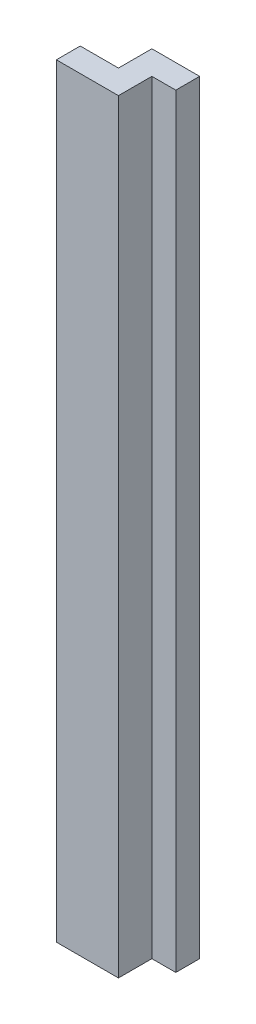
ISO-10303-21;
HEADER;
FILE_DESCRIPTION(('STEP AP214'),'2;1');
FILE_NAME('part.step','',(''),(''),'','','');
FILE_SCHEMA(('AUTOMOTIVE_DESIGN { 1 0 10303 214 1 1 1 1 }'));
ENDSEC;
DATA;
#1=APPLICATION_CONTEXT('core data for automotive mechanical design processes');
#2=APPLICATION_PROTOCOL_DEFINITION('international standard','automotive_design',2000,#1);
#3=PRODUCT_CONTEXT('',#1,'mechanical');
#4=PRODUCT('Part','Part','',(#3));
#5=PRODUCT_RELATED_PRODUCT_CATEGORY('part','',(#4));
#6=PRODUCT_DEFINITION_FORMATION('','',#4);
#7=PRODUCT_DEFINITION_CONTEXT('part definition',#1,'design');
#8=PRODUCT_DEFINITION('design','',#6,#7);
#9=PRODUCT_DEFINITION_SHAPE('','',#8);
#10=(LENGTH_UNIT() NAMED_UNIT(*) SI_UNIT(.MILLI.,.METRE.));
#11=(NAMED_UNIT(*) PLANE_ANGLE_UNIT() SI_UNIT($,.RADIAN.));
#12=(NAMED_UNIT(*) SI_UNIT($,.STERADIAN.) SOLID_ANGLE_UNIT());
#13=UNCERTAINTY_MEASURE_WITH_UNIT(LENGTH_MEASURE(1.E-05),#10,'distance_accuracy_value','');
#14=(GEOMETRIC_REPRESENTATION_CONTEXT(3) GLOBAL_UNCERTAINTY_ASSIGNED_CONTEXT((#13)) GLOBAL_UNIT_ASSIGNED_CONTEXT((#10,
#11,#12)) REPRESENTATION_CONTEXT('',''));
#15=CARTESIAN_POINT('',(0.,0.,0.));
#16=DIRECTION('',(0.,0.,1.));
#17=DIRECTION('',(1.,0.,0.));
#18=AXIS2_PLACEMENT_3D('',#15,#16,#17);
#19=CARTESIAN_POINT('',(13.,160.,5.));
#20=DIRECTION('',(-1.,0.,0.));
#21=DIRECTION('',(0.,0.,1.));
#22=AXIS2_PLACEMENT_3D('',#19,#20,#21);
#23=PLANE('',#22);
#24=DIRECTION('',(0.,-1.,0.));
#25=VECTOR('',#24,1.);
#26=CARTESIAN_POINT('',(13.,160.,-2.));
#27=LINE('',#26,#25);
#28=CARTESIAN_POINT('',(13.,160.,-2.));
#29=VERTEX_POINT('',#28);
#30=CARTESIAN_POINT('',(13.,0.,-2.));
#31=VERTEX_POINT('',#30);
#32=EDGE_CURVE('E48',#29,#31,#27,.T.);
#33=ORIENTED_EDGE('',*,*,#32,.F.);
#34=DIRECTION('',(0.,0.,-1.));
#35=VECTOR('',#34,1.);
#36=CARTESIAN_POINT('',(13.,160.,5.));
#37=LINE('',#36,#35);
#38=CARTESIAN_POINT('',(13.,160.,5.));
#39=VERTEX_POINT('',#38);
#40=EDGE_CURVE('E110',#39,#29,#37,.T.);
#41=ORIENTED_EDGE('',*,*,#40,.F.);
#42=DIRECTION('',(0.,-1.,0.));
#43=VECTOR('',#42,1.);
#44=CARTESIAN_POINT('',(13.,160.,5.));
#45=LINE('',#44,#43);
#46=CARTESIAN_POINT('',(13.,0.,5.));
#47=VERTEX_POINT('',#46);
#48=EDGE_CURVE('E41',#39,#47,#45,.T.);
#49=ORIENTED_EDGE('',*,*,#48,.T.);
#50=DIRECTION('',(0.,0.,-1.));
#51=VECTOR('',#50,1.);
#52=CARTESIAN_POINT('',(13.,0.,5.));
#53=LINE('',#52,#51);
#54=EDGE_CURVE('E133',#47,#31,#53,.T.);
#55=ORIENTED_EDGE('',*,*,#54,.T.);
#56=EDGE_LOOP('',(#33,#41,#49,#55));
#57=FACE_BOUND('',#56,.T.);
#58=ADVANCED_FACE('F33',(#57),#23,.F.);
#59=CARTESIAN_POINT('',(0.,160.,0.));
#60=DIRECTION('',(1.,0.,0.));
#61=DIRECTION('',(0.,0.,-1.));
#62=AXIS2_PLACEMENT_3D('',#59,#60,#61);
#63=PLANE('',#62);
#64=DIRECTION('',(0.,0.,1.));
#65=VECTOR('',#64,1.);
#66=CARTESIAN_POINT('',(0.,0.,0.));
#67=LINE('',#66,#65);
#68=CARTESIAN_POINT('',(0.,0.,0.));
#69=VERTEX_POINT('',#68);
#70=CARTESIAN_POINT('',(0.,0.,5.));
#71=VERTEX_POINT('',#70);
#72=EDGE_CURVE('E127',#69,#71,#67,.T.);
#73=ORIENTED_EDGE('',*,*,#72,.T.);
#74=DIRECTION('',(0.,-1.,0.));
#75=VECTOR('',#74,1.);
#76=CARTESIAN_POINT('',(0.,160.,5.));
#77=LINE('',#76,#75);
#78=CARTESIAN_POINT('',(0.,160.,5.));
#79=VERTEX_POINT('',#78);
#80=EDGE_CURVE('E11',#79,#71,#77,.T.);
#81=ORIENTED_EDGE('',*,*,#80,.F.);
#82=DIRECTION('',(0.,0.,1.));
#83=VECTOR('',#82,1.);
#84=CARTESIAN_POINT('',(0.,160.,0.));
#85=LINE('',#84,#83);
#86=CARTESIAN_POINT('',(0.,160.,0.));
#87=VERTEX_POINT('',#86);
#88=EDGE_CURVE('E139',#87,#79,#85,.T.);
#89=ORIENTED_EDGE('',*,*,#88,.F.);
#90=DIRECTION('',(0.,-1.,0.));
#91=VECTOR('',#90,1.);
#92=CARTESIAN_POINT('',(0.,160.,0.));
#93=LINE('',#92,#91);
#94=EDGE_CURVE('E123',#87,#69,#93,.T.);
#95=ORIENTED_EDGE('',*,*,#94,.T.);
#96=EDGE_LOOP('',(#73,#81,#89,#95));
#97=FACE_BOUND('',#96,.T.);
#98=ADVANCED_FACE('F35',(#97),#63,.F.);
#99=CARTESIAN_POINT('',(8.,160.,5.));
#100=DIRECTION('',(0.,0.,-1.));
#101=DIRECTION('',(-1.,0.,0.));
#102=AXIS2_PLACEMENT_3D('',#99,#100,#101);
#103=PLANE('',#102);
#104=DIRECTION('',(1.,0.,0.));
#105=VECTOR('',#104,1.);
#106=CARTESIAN_POINT('',(8.,0.,5.));
#107=LINE('',#106,#105);
#108=EDGE_CURVE('E130',#71,#47,#107,.T.);
#109=ORIENTED_EDGE('',*,*,#108,.T.);
#110=ORIENTED_EDGE('',*,*,#48,.F.);
#111=DIRECTION('',(1.,0.,0.));
#112=VECTOR('',#111,1.);
#113=CARTESIAN_POINT('',(0.,160.,5.));
#114=LINE('',#113,#112);
#115=EDGE_CURVE('E89',#79,#39,#114,.T.);
#116=ORIENTED_EDGE('',*,*,#115,.F.);
#117=ORIENTED_EDGE('',*,*,#80,.T.);
#118=EDGE_LOOP('',(#109,#110,#116,#117));
#119=FACE_BOUND('',#118,.T.);
#120=ADVANCED_FACE('F179',(#119),#103,.F.);
#121=CARTESIAN_POINT('',(8.,160.,-7.));
#122=DIRECTION('',(0.,0.,1.));
#123=DIRECTION('',(1.,0.,0.));
#124=AXIS2_PLACEMENT_3D('',#121,#122,#123);
#125=PLANE('',#124);
#126=DIRECTION('',(-1.,0.,0.));
#127=VECTOR('',#126,1.);
#128=CARTESIAN_POINT('',(8.,0.,-7.));
#129=LINE('',#128,#127);
#130=CARTESIAN_POINT('',(18.,0.,-7.));
#131=VERTEX_POINT('',#130);
#132=CARTESIAN_POINT('',(8.,0.,-7.));
#133=VERTEX_POINT('',#132);
#134=EDGE_CURVE('E116',#131,#133,#129,.T.);
#135=ORIENTED_EDGE('',*,*,#134,.T.);
#136=DIRECTION('',(0.,-1.,0.));
#137=VECTOR('',#136,1.);
#138=CARTESIAN_POINT('',(8.,160.,-7.));
#139=LINE('',#138,#137);
#140=CARTESIAN_POINT('',(8.,160.,-7.));
#141=VERTEX_POINT('',#140);
#142=EDGE_CURVE('E113',#141,#133,#139,.T.);
#143=ORIENTED_EDGE('',*,*,#142,.F.);
#144=DIRECTION('',(-1.,0.,0.));
#145=VECTOR('',#144,1.);
#146=CARTESIAN_POINT('',(8.,160.,-7.));
#147=LINE('',#146,#145);
#148=CARTESIAN_POINT('',(18.,160.,-7.));
#149=VERTEX_POINT('',#148);
#150=EDGE_CURVE('E97',#149,#141,#147,.T.);
#151=ORIENTED_EDGE('',*,*,#150,.F.);
#152=DIRECTION('',(0.,1.,0.));
#153=VECTOR('',#152,1.);
#154=CARTESIAN_POINT('',(18.,160.,-7.));
#155=LINE('',#154,#153);
#156=EDGE_CURVE('E169',#131,#149,#155,.T.);
#157=ORIENTED_EDGE('',*,*,#156,.F.);
#158=EDGE_LOOP('',(#135,#143,#151,#157));
#159=FACE_BOUND('',#158,.T.);
#160=ADVANCED_FACE('F114',(#159),#125,.F.);
#161=CARTESIAN_POINT('',(8.,160.,0.));
#162=DIRECTION('',(1.,0.,0.));
#163=DIRECTION('',(0.,0.,-1.));
#164=AXIS2_PLACEMENT_3D('',#161,#162,#163);
#165=PLANE('',#164);
#166=DIRECTION('',(0.,0.,1.));
#167=VECTOR('',#166,1.);
#168=CARTESIAN_POINT('',(8.,0.,0.));
#169=LINE('',#168,#167);
#170=CARTESIAN_POINT('',(8.,0.,0.));
#171=VERTEX_POINT('',#170);
#172=EDGE_CURVE('E136',#133,#171,#169,.T.);
#173=ORIENTED_EDGE('',*,*,#172,.T.);
#174=DIRECTION('',(0.,-1.,0.));
#175=VECTOR('',#174,1.);
#176=CARTESIAN_POINT('',(8.,160.,0.));
#177=LINE('',#176,#175);
#178=CARTESIAN_POINT('',(8.,160.,0.));
#179=VERTEX_POINT('',#178);
#180=EDGE_CURVE('E119',#179,#171,#177,.T.);
#181=ORIENTED_EDGE('',*,*,#180,.F.);
#182=DIRECTION('',(0.,0.,1.));
#183=VECTOR('',#182,1.);
#184=CARTESIAN_POINT('',(8.,160.,0.));
#185=LINE('',#184,#183);
#186=EDGE_CURVE('E101',#141,#179,#185,.T.);
#187=ORIENTED_EDGE('',*,*,#186,.F.);
#188=ORIENTED_EDGE('',*,*,#142,.T.);
#189=EDGE_LOOP('',(#173,#181,#187,#188));
#190=FACE_BOUND('',#189,.T.);
#191=ADVANCED_FACE('F121',(#190),#165,.F.);
#192=CARTESIAN_POINT('',(0.,160.,0.));
#193=DIRECTION('',(0.,0.,1.));
#194=DIRECTION('',(1.,0.,0.));
#195=AXIS2_PLACEMENT_3D('',#192,#193,#194);
#196=PLANE('',#195);
#197=DIRECTION('',(-1.,0.,0.));
#198=VECTOR('',#197,1.);
#199=CARTESIAN_POINT('',(0.,0.,0.));
#200=LINE('',#199,#198);
#201=EDGE_CURVE('E81',#171,#69,#200,.T.);
#202=ORIENTED_EDGE('',*,*,#201,.T.);
#203=ORIENTED_EDGE('',*,*,#94,.F.);
#204=DIRECTION('',(-1.,0.,0.));
#205=VECTOR('',#204,1.);
#206=CARTESIAN_POINT('',(0.,160.,0.));
#207=LINE('',#206,#205);
#208=EDGE_CURVE('E57',#179,#87,#207,.T.);
#209=ORIENTED_EDGE('',*,*,#208,.F.);
#210=ORIENTED_EDGE('',*,*,#180,.T.);
#211=EDGE_LOOP('',(#202,#203,#209,#210));
#212=FACE_BOUND('',#211,.T.);
#213=ADVANCED_FACE('F175',(#212),#196,.F.);
#214=CARTESIAN_POINT('',(0.,160.,0.));
#215=DIRECTION('',(0.,1.,0.));
#216=DIRECTION('',(0.,0.,1.));
#217=AXIS2_PLACEMENT_3D('',#214,#215,#216);
#218=PLANE('',#217);
#219=ORIENTED_EDGE('',*,*,#88,.T.);
#220=ORIENTED_EDGE('',*,*,#115,.T.);
#221=ORIENTED_EDGE('',*,*,#40,.T.);
#222=DIRECTION('',(-1.,0.,0.));
#223=VECTOR('',#222,1.);
#224=CARTESIAN_POINT('',(18.,160.,-2.));
#225=LINE('',#224,#223);
#226=CARTESIAN_POINT('',(18.,160.,-2.));
#227=VERTEX_POINT('',#226);
#228=EDGE_CURVE('E131',#227,#29,#225,.T.);
#229=ORIENTED_EDGE('',*,*,#228,.F.);
#230=DIRECTION('',(0.,0.,1.));
#231=VECTOR('',#230,1.);
#232=CARTESIAN_POINT('',(18.,160.,-7.));
#233=LINE('',#232,#231);
#234=EDGE_CURVE('E106',#149,#227,#233,.T.);
#235=ORIENTED_EDGE('',*,*,#234,.F.);
#236=ORIENTED_EDGE('',*,*,#150,.T.);
#237=ORIENTED_EDGE('',*,*,#186,.T.);
#238=ORIENTED_EDGE('',*,*,#208,.T.);
#239=EDGE_LOOP('',(#219,#220,#221,#229,#235,#236,#237,#238));
#240=FACE_BOUND('',#239,.T.);
#241=ADVANCED_FACE('F99',(#240),#218,.T.);
#242=CARTESIAN_POINT('',(0.,0.,0.));
#243=DIRECTION('',(0.,1.,0.));
#244=DIRECTION('',(0.,0.,1.));
#245=AXIS2_PLACEMENT_3D('',#242,#243,#244);
#246=PLANE('',#245);
#247=ORIENTED_EDGE('',*,*,#72,.F.);
#248=ORIENTED_EDGE('',*,*,#201,.F.);
#249=ORIENTED_EDGE('',*,*,#172,.F.);
#250=ORIENTED_EDGE('',*,*,#134,.F.);
#251=DIRECTION('',(0.,0.,-1.));
#252=VECTOR('',#251,1.);
#253=CARTESIAN_POINT('',(18.,0.,-7.));
#254=LINE('',#253,#252);
#255=CARTESIAN_POINT('',(18.,0.,-2.));
#256=VERTEX_POINT('',#255);
#257=EDGE_CURVE('E152',#256,#131,#254,.T.);
#258=ORIENTED_EDGE('',*,*,#257,.F.);
#259=DIRECTION('',(-1.,0.,0.));
#260=VECTOR('',#259,1.);
#261=CARTESIAN_POINT('',(18.,0.,-2.));
#262=LINE('',#261,#260);
#263=EDGE_CURVE('E149',#256,#31,#262,.T.);
#264=ORIENTED_EDGE('',*,*,#263,.T.);
#265=ORIENTED_EDGE('',*,*,#54,.F.);
#266=ORIENTED_EDGE('',*,*,#108,.F.);
#267=EDGE_LOOP('',(#247,#248,#249,#250,#258,#264,#265,#266));
#268=FACE_BOUND('',#267,.T.);
#269=ADVANCED_FACE('F146',(#268),#246,.F.);
#270=CARTESIAN_POINT('',(18.,160.,-2.));
#271=DIRECTION('',(0.,0.,-1.));
#272=DIRECTION('',(-1.,0.,0.));
#273=AXIS2_PLACEMENT_3D('',#270,#271,#272);
#274=PLANE('',#273);
#275=ORIENTED_EDGE('',*,*,#32,.T.);
#276=ORIENTED_EDGE('',*,*,#263,.F.);
#277=DIRECTION('',(0.,-1.,0.));
#278=VECTOR('',#277,1.);
#279=CARTESIAN_POINT('',(18.,160.,-2.));
#280=LINE('',#279,#278);
#281=EDGE_CURVE('E158',#227,#256,#280,.T.);
#282=ORIENTED_EDGE('',*,*,#281,.F.);
#283=ORIENTED_EDGE('',*,*,#228,.T.);
#284=EDGE_LOOP('',(#275,#276,#282,#283));
#285=FACE_BOUND('',#284,.T.);
#286=ADVANCED_FACE('F164',(#285),#274,.F.);
#287=CARTESIAN_POINT('',(18.,0.,0.));
#288=DIRECTION('',(-1.,0.,0.));
#289=DIRECTION('',(0.,0.,1.));
#290=AXIS2_PLACEMENT_3D('',#287,#288,#289);
#291=PLANE('',#290);
#292=ORIENTED_EDGE('',*,*,#156,.T.);
#293=ORIENTED_EDGE('',*,*,#234,.T.);
#294=ORIENTED_EDGE('',*,*,#281,.T.);
#295=ORIENTED_EDGE('',*,*,#257,.T.);
#296=EDGE_LOOP('',(#292,#293,#294,#295));
#297=FACE_BOUND('',#296,.T.);
#298=ADVANCED_FACE('F172',(#297),#291,.F.);
#299=CLOSED_SHELL('',(#58,#98,#120,#160,#191,#213,#241,#269,#286,#298));
#300=MANIFOLD_SOLID_BREP('B2',#299);
#301=ADVANCED_BREP_SHAPE_REPRESENTATION('',(#18,#300),#14);
#302=SHAPE_DEFINITION_REPRESENTATION(#9,#301);
ENDSEC;
END-ISO-10303-21;
